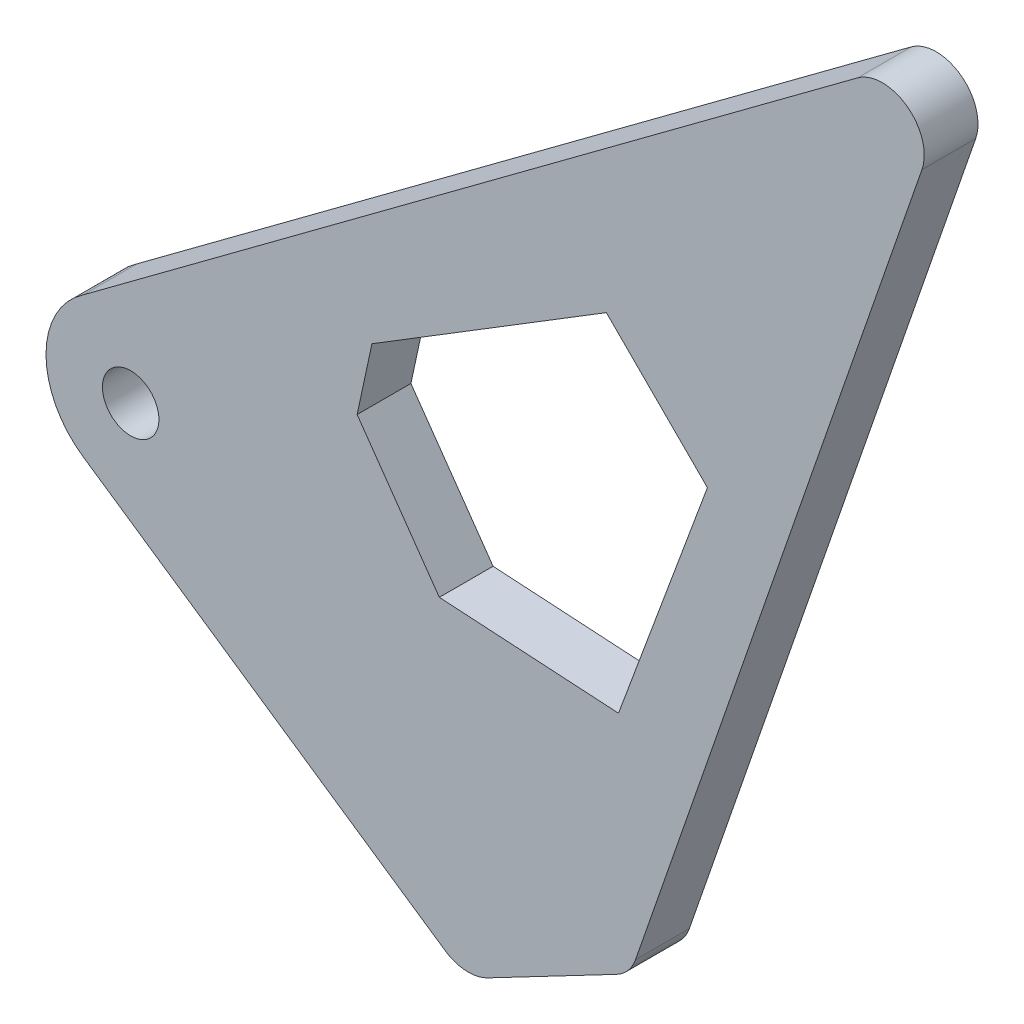
ISO-10303-21;
HEADER;
FILE_DESCRIPTION(('STEP AP214'),'2;1');
FILE_NAME('part.step','',(''),(''),'','','');
FILE_SCHEMA(('AUTOMOTIVE_DESIGN { 1 0 10303 214 1 1 1 1 }'));
ENDSEC;
DATA;
#1=APPLICATION_CONTEXT('core data for automotive mechanical design processes');
#2=APPLICATION_PROTOCOL_DEFINITION('international standard','automotive_design',2000,#1);
#3=PRODUCT_CONTEXT('',#1,'mechanical');
#4=PRODUCT('Part','Part','',(#3));
#5=PRODUCT_RELATED_PRODUCT_CATEGORY('part','',(#4));
#6=PRODUCT_DEFINITION_FORMATION('','',#4);
#7=PRODUCT_DEFINITION_CONTEXT('part definition',#1,'design');
#8=PRODUCT_DEFINITION('design','',#6,#7);
#9=PRODUCT_DEFINITION_SHAPE('','',#8);
#10=(LENGTH_UNIT() NAMED_UNIT(*) SI_UNIT(.MILLI.,.METRE.));
#11=(NAMED_UNIT(*) PLANE_ANGLE_UNIT() SI_UNIT($,.RADIAN.));
#12=(NAMED_UNIT(*) SI_UNIT($,.STERADIAN.) SOLID_ANGLE_UNIT());
#13=UNCERTAINTY_MEASURE_WITH_UNIT(LENGTH_MEASURE(1.E-05),#10,'distance_accuracy_value','');
#14=(GEOMETRIC_REPRESENTATION_CONTEXT(3) GLOBAL_UNCERTAINTY_ASSIGNED_CONTEXT((#13)) GLOBAL_UNIT_ASSIGNED_CONTEXT((#10,
#11,#12)) REPRESENTATION_CONTEXT('',''));
#15=CARTESIAN_POINT('',(0.,0.,0.));
#16=DIRECTION('',(0.,0.,1.));
#17=DIRECTION('',(1.,0.,0.));
#18=AXIS2_PLACEMENT_3D('',#15,#16,#17);
#19=CARTESIAN_POINT('',(-135.98996462201,14.8069678189548,4.7625));
#20=DIRECTION('',(0.,0.,-1.));
#21=DIRECTION('',(-1.,0.,0.));
#22=AXIS2_PLACEMENT_3D('',#19,#20,#21);
#23=CYLINDRICAL_SURFACE('',#22,15.);
#24=CARTESIAN_POINT('',(-135.98996462201,14.8069678189548,-4.7625));
#25=DIRECTION('',(0.,0.,1.));
#26=DIRECTION('',(1.,0.,0.));
#27=AXIS2_PLACEMENT_3D('',#24,#25,#26);
#28=CIRCLE('',#27,15.);
#29=CARTESIAN_POINT('',(-144.436770340403,27.2025909640701,-4.7625));
#30=VERTEX_POINT('',#29);
#31=CARTESIAN_POINT('',(-144.436770340403,2.41134467383937,-4.7625));
#32=VERTEX_POINT('',#31);
#33=EDGE_CURVE('E214',#30,#32,#28,.T.);
#34=ORIENTED_EDGE('',*,*,#33,.T.);
#35=DIRECTION('',(0.,0.,-1.));
#36=VECTOR('',#35,1.);
#37=CARTESIAN_POINT('',(-144.436770340403,2.41134467383937,4.7625));
#38=LINE('',#37,#36);
#39=CARTESIAN_POINT('',(-144.436770340403,2.41134467383937,4.7625));
#40=VERTEX_POINT('',#39);
#41=EDGE_CURVE('E11',#40,#32,#38,.T.);
#42=ORIENTED_EDGE('',*,*,#41,.F.);
#43=CARTESIAN_POINT('',(-135.98996462201,14.8069678189548,4.7625));
#44=DIRECTION('',(0.,0.,1.));
#45=DIRECTION('',(1.,0.,0.));
#46=AXIS2_PLACEMENT_3D('',#43,#44,#45);
#47=CIRCLE('',#46,15.);
#48=CARTESIAN_POINT('',(-144.436770340403,27.2025909640701,4.7625));
#49=VERTEX_POINT('',#48);
#50=EDGE_CURVE('E215',#49,#40,#47,.T.);
#51=ORIENTED_EDGE('',*,*,#50,.F.);
#52=DIRECTION('',(0.,0.,-1.));
#53=VECTOR('',#52,1.);
#54=CARTESIAN_POINT('',(-144.436770340403,27.2025909640701,4.7625));
#55=LINE('',#54,#53);
#56=EDGE_CURVE('E242',#49,#30,#55,.T.);
#57=ORIENTED_EDGE('',*,*,#56,.T.);
#58=EDGE_LOOP('',(#34,#42,#51,#57));
#59=FACE_BOUND('',#58,.T.);
#60=ADVANCED_FACE('F39',(#59),#23,.T.);
#61=CARTESIAN_POINT('',(-44.6794433362743,-65.5667432629609,4.7625));
#62=DIRECTION('',(-0.563120381226211,-0.826374876341027,0.));
#63=DIRECTION('',(0.826374876341027,-0.563120381226211,0.));
#64=AXIS2_PLACEMENT_3D('',#61,#62,#63);
#65=PLANE('',#64);
#66=DIRECTION('',(-0.826374876341027,0.563120381226211,0.));
#67=VECTOR('',#66,1.);
#68=CARTESIAN_POINT('',(-44.6794433362743,-65.5667432629609,-4.7625));
#69=LINE('',#68,#67);
#70=CARTESIAN_POINT('',(-80.3107623465941,-41.2863318913986,-4.7625));
#71=VERTEX_POINT('',#70);
#72=EDGE_CURVE('E246',#71,#32,#69,.T.);
#73=ORIENTED_EDGE('',*,*,#72,.F.);
#74=DIRECTION('',(0.,0.,-1.));
#75=VECTOR('',#74,1.);
#76=CARTESIAN_POINT('',(-80.3107623465941,-41.2863318913986,4.7625));
#77=LINE('',#76,#75);
#78=CARTESIAN_POINT('',(-80.3107623465941,-41.2863318913986,4.7625));
#79=VERTEX_POINT('',#78);
#80=EDGE_CURVE('E47',#79,#71,#77,.T.);
#81=ORIENTED_EDGE('',*,*,#80,.F.);
#82=DIRECTION('',(-0.826374876341027,0.563120381226211,0.));
#83=VECTOR('',#82,1.);
#84=CARTESIAN_POINT('',(-44.6794433362743,-65.5667432629609,4.7625));
#85=LINE('',#84,#83);
#86=EDGE_CURVE('E218',#79,#40,#85,.T.);
#87=ORIENTED_EDGE('',*,*,#86,.T.);
#88=ORIENTED_EDGE('',*,*,#41,.T.);
#89=EDGE_LOOP('',(#73,#81,#87,#88));
#90=FACE_BOUND('',#89,.T.);
#91=ADVANCED_FACE('F302',(#90),#65,.T.);
#92=CARTESIAN_POINT('',(-76.1757268505461,-35.2181987521369,4.7625));
#93=DIRECTION('',(0.,0.,-1.));
#94=DIRECTION('',(-1.,0.,0.));
#95=AXIS2_PLACEMENT_3D('',#92,#93,#94);
#96=CYLINDRICAL_SURFACE('',#95,7.3430755374968);
#97=CARTESIAN_POINT('',(-76.1757268505461,-35.2181987521369,-4.7625));
#98=DIRECTION('',(0.,0.,1.));
#99=DIRECTION('',(1.,0.,0.));
#100=AXIS2_PLACEMENT_3D('',#97,#98,#99);
#101=CIRCLE('',#100,7.3430755374968);
#102=CARTESIAN_POINT('',(-72.768932332621,-41.7231591257302,-4.7625));
#103=VERTEX_POINT('',#102);
#104=EDGE_CURVE('E250',#71,#103,#101,.T.);
#105=ORIENTED_EDGE('',*,*,#104,.T.);
#106=DIRECTION('',(0.,0.,-1.));
#107=VECTOR('',#106,1.);
#108=CARTESIAN_POINT('',(-72.768932332621,-41.7231591257302,4.7625));
#109=LINE('',#108,#107);
#110=CARTESIAN_POINT('',(-72.768932332621,-41.7231591257302,4.7625));
#111=VERTEX_POINT('',#110);
#112=EDGE_CURVE('E286',#111,#103,#109,.T.);
#113=ORIENTED_EDGE('',*,*,#112,.F.);
#114=CARTESIAN_POINT('',(-76.1757268505461,-35.2181987521369,4.7625));
#115=DIRECTION('',(0.,0.,1.));
#116=DIRECTION('',(1.,0.,0.));
#117=AXIS2_PLACEMENT_3D('',#114,#115,#116);
#118=CIRCLE('',#117,7.3430755374968);
#119=EDGE_CURVE('E223',#79,#111,#118,.T.);
#120=ORIENTED_EDGE('',*,*,#119,.F.);
#121=ORIENTED_EDGE('',*,*,#80,.T.);
#122=EDGE_LOOP('',(#105,#113,#120,#121));
#123=FACE_BOUND('',#122,.T.);
#124=ADVANCED_FACE('F293',(#123),#96,.T.);
#125=CARTESIAN_POINT('',(1.48468298043132,-2.83486541505193,4.7625));
#126=DIRECTION('',(-0.46394654399625,0.885863197290606,0.));
#127=DIRECTION('',(-0.885863197290606,-0.46394654399625,0.));
#128=AXIS2_PLACEMENT_3D('',#125,#126,#127);
#129=PLANE('',#128);
#130=DIRECTION('',(0.885863197290606,0.46394654399625,0.));
#131=VECTOR('',#130,1.);
#132=CARTESIAN_POINT('',(1.48468298043132,-2.83486541505193,-4.7625));
#133=LINE('',#132,#131);
#134=CARTESIAN_POINT('',(-49.9662161408965,-29.7808621624583,-4.7625));
#135=VERTEX_POINT('',#134);
#136=EDGE_CURVE('E253',#103,#135,#133,.T.);
#137=ORIENTED_EDGE('',*,*,#136,.T.);
#138=DIRECTION('',(0.,0.,-1.));
#139=VECTOR('',#138,1.);
#140=CARTESIAN_POINT('',(-49.9662161408965,-29.7808621624583,4.7625));
#141=LINE('',#140,#139);
#142=CARTESIAN_POINT('',(-49.9662161408965,-29.7808621624583,4.7625));
#143=VERTEX_POINT('',#142);
#144=EDGE_CURVE('E282',#143,#135,#141,.T.);
#145=ORIENTED_EDGE('',*,*,#144,.F.);
#146=DIRECTION('',(0.885863197290606,0.46394654399625,0.));
#147=VECTOR('',#146,1.);
#148=CARTESIAN_POINT('',(1.48468298043132,-2.83486541505193,4.7625));
#149=LINE('',#148,#147);
#150=EDGE_CURVE('E226',#111,#143,#149,.T.);
#151=ORIENTED_EDGE('',*,*,#150,.F.);
#152=ORIENTED_EDGE('',*,*,#112,.T.);
#153=EDGE_LOOP('',(#137,#145,#151,#152));
#154=FACE_BOUND('',#153,.T.);
#155=ADVANCED_FACE('F327',(#154),#129,.F.);
#156=CARTESIAN_POINT('',(-53.2361349334904,-23.5372533804274,4.7625));
#157=DIRECTION('',(0.,0.,-1.));
#158=DIRECTION('',(-1.,0.,0.));
#159=AXIS2_PLACEMENT_3D('',#156,#157,#158);
#160=CYLINDRICAL_SURFACE('',#159,7.04805076125397);
#161=CARTESIAN_POINT('',(-53.2361349334904,-23.5372533804274,-4.7625));
#162=DIRECTION('',(0.,0.,1.));
#163=DIRECTION('',(1.,0.,0.));
#164=AXIS2_PLACEMENT_3D('',#161,#162,#163);
#165=CIRCLE('',#164,7.04805076125397);
#166=CARTESIAN_POINT('',(-46.5758038889972,-25.8426839065925,-4.7625));
#167=VERTEX_POINT('',#166);
#168=EDGE_CURVE('E256',#135,#167,#165,.T.);
#169=ORIENTED_EDGE('',*,*,#168,.T.);
#170=DIRECTION('',(0.,0.,-1.));
#171=VECTOR('',#170,1.);
#172=CARTESIAN_POINT('',(-46.5758038889972,-25.8426839065925,4.7625));
#173=LINE('',#172,#171);
#174=CARTESIAN_POINT('',(-46.5758038889972,-25.8426839065925,4.7625));
#175=VERTEX_POINT('',#174);
#176=EDGE_CURVE('E278',#175,#167,#173,.T.);
#177=ORIENTED_EDGE('',*,*,#176,.F.);
#178=CARTESIAN_POINT('',(-53.2361349334904,-23.5372533804274,4.7625));
#179=DIRECTION('',(0.,0.,1.));
#180=DIRECTION('',(1.,0.,0.));
#181=AXIS2_PLACEMENT_3D('',#178,#179,#180);
#182=CIRCLE('',#181,7.04805076125397);
#183=EDGE_CURVE('E229',#143,#175,#182,.T.);
#184=ORIENTED_EDGE('',*,*,#183,.F.);
#185=ORIENTED_EDGE('',*,*,#144,.T.);
#186=EDGE_LOOP('',(#169,#177,#184,#185));
#187=FACE_BOUND('',#186,.T.);
#188=ADVANCED_FACE('F323',(#187),#160,.T.);
#189=CARTESIAN_POINT('',(-33.6042241942555,11.6318849240364,4.7625));
#190=DIRECTION('',(-0.944989085650135,0.327101861813902,0.));
#191=DIRECTION('',(-0.327101861813902,-0.944989085650136,0.));
#192=AXIS2_PLACEMENT_3D('',#189,#190,#191);
#193=PLANE('',#192);
#194=DIRECTION('',(0.327101861813902,0.944989085650136,0.));
#195=VECTOR('',#194,1.);
#196=CARTESIAN_POINT('',(-33.6042241942555,11.6318849240364,-4.7625));
#197=LINE('',#196,#195);
#198=CARTESIAN_POINT('',(4.15447512995117,120.715821505298,-4.7625));
#199=VERTEX_POINT('',#198);
#200=EDGE_CURVE('E259',#167,#199,#197,.T.);
#201=ORIENTED_EDGE('',*,*,#200,.T.);
#202=DIRECTION('',(0.,0.,-1.));
#203=VECTOR('',#202,1.);
#204=CARTESIAN_POINT('',(4.15447512995117,120.715821505298,4.7625));
#205=LINE('',#204,#203);
#206=CARTESIAN_POINT('',(4.15447512995117,120.715821505298,4.7625));
#207=VERTEX_POINT('',#206);
#208=EDGE_CURVE('E274',#207,#199,#205,.T.);
#209=ORIENTED_EDGE('',*,*,#208,.F.);
#210=DIRECTION('',(0.327101861813902,0.944989085650136,0.));
#211=VECTOR('',#210,1.);
#212=CARTESIAN_POINT('',(-33.6042241942555,11.6318849240364,4.7625));
#213=LINE('',#212,#211);
#214=EDGE_CURVE('E232',#175,#207,#213,.T.);
#215=ORIENTED_EDGE('',*,*,#214,.F.);
#216=ORIENTED_EDGE('',*,*,#176,.T.);
#217=EDGE_LOOP('',(#201,#209,#215,#216));
#218=FACE_BOUND('',#217,.T.);
#219=ADVANCED_FACE('F318',(#218),#193,.F.);
#220=CARTESIAN_POINT('',(-2.84319901034025,123.138021162855,4.7625));
#221=DIRECTION('',(0.,0.,-1.));
#222=DIRECTION('',(-1.,0.,0.));
#223=AXIS2_PLACEMENT_3D('',#220,#221,#222);
#224=CYLINDRICAL_SURFACE('',#223,7.40503170518327);
#225=CARTESIAN_POINT('',(-2.84319901034025,123.138021162855,-4.7625));
#226=DIRECTION('',(0.,0.,1.));
#227=DIRECTION('',(1.,0.,0.));
#228=AXIS2_PLACEMENT_3D('',#225,#226,#227);
#229=CIRCLE('',#228,7.40503170518327);
#230=CARTESIAN_POINT('',(-7.25833485906466,129.082856736029,-4.7625));
#231=VERTEX_POINT('',#230);
#232=EDGE_CURVE('E262',#199,#231,#229,.T.);
#233=ORIENTED_EDGE('',*,*,#232,.T.);
#234=DIRECTION('',(0.,0.,-1.));
#235=VECTOR('',#234,1.);
#236=CARTESIAN_POINT('',(-7.25833485906466,129.082856736029,4.7625));
#237=LINE('',#236,#235);
#238=CARTESIAN_POINT('',(-7.25833485906466,129.082856736029,4.7625));
#239=VERTEX_POINT('',#238);
#240=EDGE_CURVE('E271',#239,#231,#237,.T.);
#241=ORIENTED_EDGE('',*,*,#240,.F.);
#242=CARTESIAN_POINT('',(-2.84319901034025,123.138021162855,4.7625));
#243=DIRECTION('',(0.,0.,1.));
#244=DIRECTION('',(1.,0.,0.));
#245=AXIS2_PLACEMENT_3D('',#242,#243,#244);
#246=CIRCLE('',#245,7.40503170518327);
#247=EDGE_CURVE('E235',#207,#239,#246,.T.);
#248=ORIENTED_EDGE('',*,*,#247,.F.);
#249=ORIENTED_EDGE('',*,*,#208,.T.);
#250=EDGE_LOOP('',(#233,#241,#248,#249));
#251=FACE_BOUND('',#250,.T.);
#252=ADVANCED_FACE('F314',(#251),#224,.T.);
#253=CARTESIAN_POINT('',(-64.3675245309122,86.6687600788286,4.7625));
#254=DIRECTION('',(-0.596234563808009,0.802810279531019,0.));
#255=DIRECTION('',(-0.802810279531019,-0.596234563808009,0.));
#256=AXIS2_PLACEMENT_3D('',#253,#254,#255);
#257=PLANE('',#256);
#258=DIRECTION('',(0.802810279531019,0.596234563808009,0.));
#259=VECTOR('',#258,1.);
#260=CARTESIAN_POINT('',(-64.3675245309122,86.6687600788286,-4.7625));
#261=LINE('',#260,#259);
#262=EDGE_CURVE('E219',#30,#231,#261,.T.);
#263=ORIENTED_EDGE('',*,*,#262,.F.);
#264=ORIENTED_EDGE('',*,*,#56,.F.);
#265=DIRECTION('',(0.802810279531019,0.596234563808009,0.));
#266=VECTOR('',#265,1.);
#267=CARTESIAN_POINT('',(-64.3675245309122,86.6687600788286,4.7625));
#268=LINE('',#267,#266);
#269=EDGE_CURVE('E238',#49,#239,#268,.T.);
#270=ORIENTED_EDGE('',*,*,#269,.T.);
#271=ORIENTED_EDGE('',*,*,#240,.T.);
#272=EDGE_LOOP('',(#263,#264,#270,#271));
#273=FACE_BOUND('',#272,.T.);
#274=ADVANCED_FACE('F309',(#273),#257,.T.);
#275=CARTESIAN_POINT('',(0.,0.,4.7625));
#276=DIRECTION('',(0.,0.,1.));
#277=DIRECTION('',(1.,0.,0.));
#278=AXIS2_PLACEMENT_3D('',#275,#276,#277);
#279=PLANE('',#278);
#280=DIRECTION('',(-0.851826360587632,-0.523824256223429,0.));
#281=VECTOR('',#280,1.);
#282=CARTESIAN_POINT('',(-45.8039734392663,74.4849661535732,4.7625));
#283=LINE('',#282,#281);
#284=CARTESIAN_POINT('',(-51.7381431192521,70.8357928446165,4.7625));
#285=VERTEX_POINT('',#284);
#286=CARTESIAN_POINT('',(-93.2582606182927,45.3033067963558,4.7625));
#287=VERTEX_POINT('',#286);
#288=EDGE_CURVE('E203',#285,#287,#283,.T.);
#289=ORIENTED_EDGE('',*,*,#288,.F.);
#290=DIRECTION('',(-0.707106781186541,0.707106781186554,0.));
#291=VECTOR('',#290,1.);
#292=CARTESIAN_POINT('',(9.54882486268174,9.54882486268157,4.7625));
#293=LINE('',#292,#291);
#294=CARTESIAN_POINT('',(-33.8415407489761,52.9391904743402,4.7625));
#295=VERTEX_POINT('',#294);
#296=EDGE_CURVE('E179',#295,#285,#293,.T.);
#297=ORIENTED_EDGE('',*,*,#296,.F.);
#298=DIRECTION('',(0.347657453210015,0.937621616233076,0.));
#299=VECTOR('',#298,1.);
#300=CARTESIAN_POINT('',(-47.0079075134047,17.429898291487,4.7625));
#301=LINE('',#300,#299);
#302=CARTESIAN_POINT('',(-49.5905508348189,10.4645875155516,4.7625));
#303=VERTEX_POINT('',#302);
#304=EDGE_CURVE('E145',#303,#295,#301,.T.);
#305=ORIENTED_EDGE('',*,*,#304,.F.);
#306=DIRECTION('',(0.9981958602885,-0.0600418562579551,0.));
#307=VECTOR('',#306,1.);
#308=CARTESIAN_POINT('',(0.448404543633107,7.45472553790037,4.7625));
#309=LINE('',#308,#307);
#310=CARTESIAN_POINT('',(-81.327192371442,12.3735584350478,4.7625));
#311=VERTEX_POINT('',#310);
#312=EDGE_CURVE('E194',#311,#303,#309,.T.);
#313=ORIENTED_EDGE('',*,*,#312,.F.);
#314=DIRECTION('',(0.574093809748456,-0.818789531936323,0.));
#315=VECTOR('',#314,1.);
#316=CARTESIAN_POINT('',(-48.7067355575417,-34.1506996437936,4.7625));
#317=LINE('',#316,#315);
#318=CARTESIAN_POINT('',(-95.8830956325999,33.1336171845681,4.7625));
#319=VERTEX_POINT('',#318);
#320=EDGE_CURVE('E197',#319,#311,#317,.T.);
#321=ORIENTED_EDGE('',*,*,#320,.F.);
#322=DIRECTION('',(-0.210837872253051,-0.977521044082329,0.));
#323=VECTOR('',#322,1.);
#324=CARTESIAN_POINT('',(-98.4496293096749,21.2342337726749,4.7625));
#325=LINE('',#324,#323);
#326=EDGE_CURVE('E200',#287,#319,#325,.T.);
#327=ORIENTED_EDGE('',*,*,#326,.F.);
#328=EDGE_LOOP('',(#289,#297,#305,#313,#321,#327));
#329=FACE_BOUND('',#328,.T.);
#330=CARTESIAN_POINT('',(-135.98996462201,14.8069678189548,4.7625));
#331=DIRECTION('',(0.,0.,1.));
#332=DIRECTION('',(1.,0.,0.));
#333=AXIS2_PLACEMENT_3D('',#330,#331,#332);
#334=CIRCLE('',#333,4.99999999999999);
#335=CARTESIAN_POINT('',(-130.98996462201,14.8069678189548,4.7625));
#336=VERTEX_POINT('',#335);
#337=EDGE_CURVE('E210',#336,#336,#334,.F.);
#338=ORIENTED_EDGE('',*,*,#337,.T.);
#339=EDGE_LOOP('',(#338));
#340=FACE_BOUND('',#339,.T.);
#341=ORIENTED_EDGE('',*,*,#50,.T.);
#342=ORIENTED_EDGE('',*,*,#86,.F.);
#343=ORIENTED_EDGE('',*,*,#119,.T.);
#344=ORIENTED_EDGE('',*,*,#150,.T.);
#345=ORIENTED_EDGE('',*,*,#183,.T.);
#346=ORIENTED_EDGE('',*,*,#214,.T.);
#347=ORIENTED_EDGE('',*,*,#247,.T.);
#348=ORIENTED_EDGE('',*,*,#269,.F.);
#349=EDGE_LOOP('',(#341,#342,#343,#344,#345,#346,#347,#348));
#350=FACE_BOUND('',#349,.T.);
#351=ADVANCED_FACE('F329',(#329,#340,#350),#279,.T.);
#352=CARTESIAN_POINT('',(0.,0.,-4.7625));
#353=DIRECTION('',(0.,0.,1.));
#354=DIRECTION('',(1.,0.,0.));
#355=AXIS2_PLACEMENT_3D('',#352,#353,#354);
#356=PLANE('',#355);
#357=DIRECTION('',(0.707106781186541,-0.707106781186554,0.));
#358=VECTOR('',#357,1.);
#359=CARTESIAN_POINT('',(-51.7381431192521,70.8357928446165,-4.7625));
#360=LINE('',#359,#358);
#361=CARTESIAN_POINT('',(-51.7381431192521,70.8357928446165,-4.7625));
#362=VERTEX_POINT('',#361);
#363=CARTESIAN_POINT('',(-33.8415407489761,52.9391904743402,-4.7625));
#364=VERTEX_POINT('',#363);
#365=EDGE_CURVE('E152',#362,#364,#360,.T.);
#366=ORIENTED_EDGE('',*,*,#365,.F.);
#367=DIRECTION('',(0.851826360587632,0.523824256223429,0.));
#368=VECTOR('',#367,1.);
#369=CARTESIAN_POINT('',(-93.2582606182927,45.3033067963558,-4.7625));
#370=LINE('',#369,#368);
#371=CARTESIAN_POINT('',(-93.2582606182927,45.3033067963558,-4.7625));
#372=VERTEX_POINT('',#371);
#373=EDGE_CURVE('E62',#372,#362,#370,.T.);
#374=ORIENTED_EDGE('',*,*,#373,.F.);
#375=DIRECTION('',(0.210837872253051,0.977521044082329,0.));
#376=VECTOR('',#375,1.);
#377=CARTESIAN_POINT('',(-95.8830956325999,33.1336171845681,-4.7625));
#378=LINE('',#377,#376);
#379=CARTESIAN_POINT('',(-95.8830956325999,33.1336171845681,-4.7625));
#380=VERTEX_POINT('',#379);
#381=EDGE_CURVE('E172',#380,#372,#378,.T.);
#382=ORIENTED_EDGE('',*,*,#381,.F.);
#383=DIRECTION('',(-0.574093809748456,0.818789531936323,0.));
#384=VECTOR('',#383,1.);
#385=CARTESIAN_POINT('',(-81.327192371442,12.3735584350478,-4.7625));
#386=LINE('',#385,#384);
#387=CARTESIAN_POINT('',(-81.327192371442,12.3735584350478,-4.7625));
#388=VERTEX_POINT('',#387);
#389=EDGE_CURVE('E165',#388,#380,#386,.T.);
#390=ORIENTED_EDGE('',*,*,#389,.F.);
#391=DIRECTION('',(-0.9981958602885,0.0600418562579551,0.));
#392=VECTOR('',#391,1.);
#393=CARTESIAN_POINT('',(-49.5905508348189,10.4645875155516,-4.7625));
#394=LINE('',#393,#392);
#395=CARTESIAN_POINT('',(-49.5905508348189,10.4645875155516,-4.7625));
#396=VERTEX_POINT('',#395);
#397=EDGE_CURVE('E161',#396,#388,#394,.T.);
#398=ORIENTED_EDGE('',*,*,#397,.F.);
#399=DIRECTION('',(-0.347657453210015,-0.937621616233076,0.));
#400=VECTOR('',#399,1.);
#401=CARTESIAN_POINT('',(-33.8415407489761,52.9391904743402,-4.7625));
#402=LINE('',#401,#400);
#403=EDGE_CURVE('E142',#364,#396,#402,.T.);
#404=ORIENTED_EDGE('',*,*,#403,.F.);
#405=EDGE_LOOP('',(#366,#374,#382,#390,#398,#404));
#406=FACE_BOUND('',#405,.T.);
#407=CARTESIAN_POINT('',(-135.98996462201,14.8069678189548,-4.7625));
#408=DIRECTION('',(0.,0.,-1.));
#409=DIRECTION('',(-1.,0.,0.));
#410=AXIS2_PLACEMENT_3D('',#407,#408,#409);
#411=CIRCLE('',#410,4.99999999999999);
#412=CARTESIAN_POINT('',(-140.98996462201,14.8069678189548,-4.7625));
#413=VERTEX_POINT('',#412);
#414=EDGE_CURVE('E206',#413,#413,#411,.T.);
#415=ORIENTED_EDGE('',*,*,#414,.F.);
#416=EDGE_LOOP('',(#415));
#417=FACE_BOUND('',#416,.T.);
#418=ORIENTED_EDGE('',*,*,#33,.F.);
#419=ORIENTED_EDGE('',*,*,#262,.T.);
#420=ORIENTED_EDGE('',*,*,#232,.F.);
#421=ORIENTED_EDGE('',*,*,#200,.F.);
#422=ORIENTED_EDGE('',*,*,#168,.F.);
#423=ORIENTED_EDGE('',*,*,#136,.F.);
#424=ORIENTED_EDGE('',*,*,#104,.F.);
#425=ORIENTED_EDGE('',*,*,#72,.T.);
#426=EDGE_LOOP('',(#418,#419,#420,#421,#422,#423,#424,#425));
#427=FACE_BOUND('',#426,.T.);
#428=ADVANCED_FACE('F157',(#406,#417,#427),#356,.F.);
#429=CARTESIAN_POINT('',(-135.98996462201,14.8069678189548,18.9046356237309));
#430=DIRECTION('',(0.,0.,-1.));
#431=DIRECTION('',(-1.,0.,0.));
#432=AXIS2_PLACEMENT_3D('',#429,#430,#431);
#433=CYLINDRICAL_SURFACE('',#432,4.99999999999999);
#434=ORIENTED_EDGE('',*,*,#414,.T.);
#435=EDGE_LOOP('',(#434));
#436=FACE_BOUND('',#435,.T.);
#437=ORIENTED_EDGE('',*,*,#337,.F.);
#438=EDGE_LOOP('',(#437));
#439=FACE_BOUND('',#438,.T.);
#440=ADVANCED_FACE('F337',(#436,#439),#433,.F.);
#441=CARTESIAN_POINT('',(-93.2582606182927,45.3033067963558,13.6125));
#442=DIRECTION('',(-0.523824256223429,0.851826360587632,0.));
#443=DIRECTION('',(-0.851826360587632,-0.523824256223429,0.));
#444=AXIS2_PLACEMENT_3D('',#441,#442,#443);
#445=PLANE('',#444);
#446=ORIENTED_EDGE('',*,*,#288,.T.);
#447=DIRECTION('',(0.,0.,-1.));
#448=VECTOR('',#447,1.);
#449=CARTESIAN_POINT('',(-93.2582606182927,45.3033067963558,13.6125));
#450=LINE('',#449,#448);
#451=EDGE_CURVE('E176',#287,#372,#450,.T.);
#452=ORIENTED_EDGE('',*,*,#451,.T.);
#453=ORIENTED_EDGE('',*,*,#373,.T.);
#454=DIRECTION('',(0.,0.,-1.));
#455=VECTOR('',#454,1.);
#456=CARTESIAN_POINT('',(-51.7381431192521,70.8357928446165,13.6125));
#457=LINE('',#456,#455);
#458=EDGE_CURVE('E149',#285,#362,#457,.T.);
#459=ORIENTED_EDGE('',*,*,#458,.F.);
#460=EDGE_LOOP('',(#446,#452,#453,#459));
#461=FACE_BOUND('',#460,.T.);
#462=ADVANCED_FACE('F376',(#461),#445,.F.);
#463=CARTESIAN_POINT('',(-95.8830956325999,33.1336171845681,13.6125));
#464=DIRECTION('',(-0.977521044082329,0.210837872253051,0.));
#465=DIRECTION('',(-0.210837872253051,-0.977521044082329,0.));
#466=AXIS2_PLACEMENT_3D('',#463,#464,#465);
#467=PLANE('',#466);
#468=ORIENTED_EDGE('',*,*,#326,.T.);
#469=DIRECTION('',(0.,0.,-1.));
#470=VECTOR('',#469,1.);
#471=CARTESIAN_POINT('',(-95.8830956325999,33.1336171845681,13.6125));
#472=LINE('',#471,#470);
#473=EDGE_CURVE('E180',#319,#380,#472,.T.);
#474=ORIENTED_EDGE('',*,*,#473,.T.);
#475=ORIENTED_EDGE('',*,*,#381,.T.);
#476=ORIENTED_EDGE('',*,*,#451,.F.);
#477=EDGE_LOOP('',(#468,#474,#475,#476));
#478=FACE_BOUND('',#477,.T.);
#479=ADVANCED_FACE('F399',(#478),#467,.F.);
#480=CARTESIAN_POINT('',(-81.327192371442,12.3735584350478,13.6125));
#481=DIRECTION('',(-0.818789531936323,-0.574093809748456,0.));
#482=DIRECTION('',(0.574093809748456,-0.818789531936323,0.));
#483=AXIS2_PLACEMENT_3D('',#480,#481,#482);
#484=PLANE('',#483);
#485=ORIENTED_EDGE('',*,*,#320,.T.);
#486=DIRECTION('',(0.,0.,-1.));
#487=VECTOR('',#486,1.);
#488=CARTESIAN_POINT('',(-81.327192371442,12.3735584350478,13.6125));
#489=LINE('',#488,#487);
#490=EDGE_CURVE('E183',#311,#388,#489,.T.);
#491=ORIENTED_EDGE('',*,*,#490,.T.);
#492=ORIENTED_EDGE('',*,*,#389,.T.);
#493=ORIENTED_EDGE('',*,*,#473,.F.);
#494=EDGE_LOOP('',(#485,#491,#492,#493));
#495=FACE_BOUND('',#494,.T.);
#496=ADVANCED_FACE('F408',(#495),#484,.F.);
#497=CARTESIAN_POINT('',(-49.5905508348189,10.4645875155516,13.6125));
#498=DIRECTION('',(-0.0600418562579551,-0.9981958602885,0.));
#499=DIRECTION('',(0.9981958602885,-0.0600418562579551,0.));
#500=AXIS2_PLACEMENT_3D('',#497,#498,#499);
#501=PLANE('',#500);
#502=ORIENTED_EDGE('',*,*,#312,.T.);
#503=DIRECTION('',(0.,0.,-1.));
#504=VECTOR('',#503,1.);
#505=CARTESIAN_POINT('',(-49.5905508348189,10.4645875155516,13.6125));
#506=LINE('',#505,#504);
#507=EDGE_CURVE('E148',#303,#396,#506,.T.);
#508=ORIENTED_EDGE('',*,*,#507,.T.);
#509=ORIENTED_EDGE('',*,*,#397,.T.);
#510=ORIENTED_EDGE('',*,*,#490,.F.);
#511=EDGE_LOOP('',(#502,#508,#509,#510));
#512=FACE_BOUND('',#511,.T.);
#513=ADVANCED_FACE('F418',(#512),#501,.F.);
#514=CARTESIAN_POINT('',(-33.8415407489761,52.9391904743402,13.6125));
#515=DIRECTION('',(0.937621616233076,-0.347657453210015,0.));
#516=DIRECTION('',(0.347657453210015,0.937621616233076,0.));
#517=AXIS2_PLACEMENT_3D('',#514,#515,#516);
#518=PLANE('',#517);
#519=ORIENTED_EDGE('',*,*,#304,.T.);
#520=DIRECTION('',(0.,0.,-1.));
#521=VECTOR('',#520,1.);
#522=CARTESIAN_POINT('',(-33.8415407489761,52.9391904743402,13.6125));
#523=LINE('',#522,#521);
#524=EDGE_CURVE('E54',#295,#364,#523,.T.);
#525=ORIENTED_EDGE('',*,*,#524,.T.);
#526=ORIENTED_EDGE('',*,*,#403,.T.);
#527=ORIENTED_EDGE('',*,*,#507,.F.);
#528=EDGE_LOOP('',(#519,#525,#526,#527));
#529=FACE_BOUND('',#528,.T.);
#530=ADVANCED_FACE('F139',(#529),#518,.F.);
#531=CARTESIAN_POINT('',(-51.7381431192521,70.8357928446165,13.6125));
#532=DIRECTION('',(0.707106781186554,0.707106781186541,0.));
#533=DIRECTION('',(-0.707106781186541,0.707106781186554,0.));
#534=AXIS2_PLACEMENT_3D('',#531,#532,#533);
#535=PLANE('',#534);
#536=ORIENTED_EDGE('',*,*,#296,.T.);
#537=ORIENTED_EDGE('',*,*,#458,.T.);
#538=ORIENTED_EDGE('',*,*,#365,.T.);
#539=ORIENTED_EDGE('',*,*,#524,.F.);
#540=EDGE_LOOP('',(#536,#537,#538,#539));
#541=FACE_BOUND('',#540,.T.);
#542=ADVANCED_FACE('F153',(#541),#535,.F.);
#543=CLOSED_SHELL('',(#60,#91,#124,#155,#188,#219,#252,#274,#351,#428,#440,#462,#479,#496,#513,
#530,#542));
#544=MANIFOLD_SOLID_BREP('B2',#543);
#545=ADVANCED_BREP_SHAPE_REPRESENTATION('',(#18,#544),#14);
#546=SHAPE_DEFINITION_REPRESENTATION(#9,#545);
ENDSEC;
END-ISO-10303-21;
